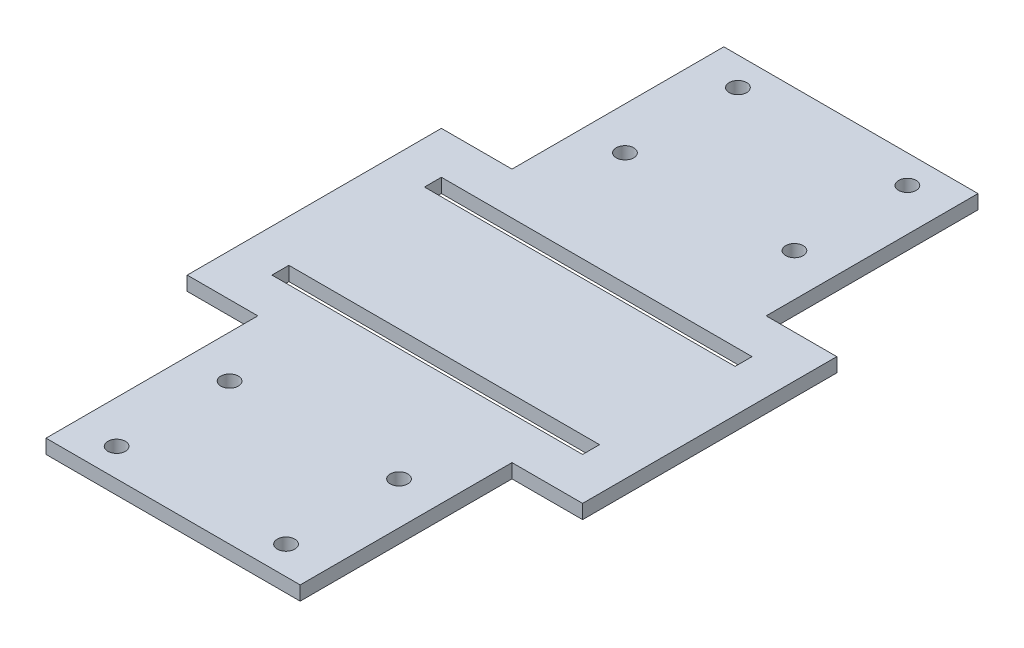
ISO-10303-21;
HEADER;
FILE_DESCRIPTION(('STEP AP214'),'2;1');
FILE_NAME('part.step','',(''),(''),'','','');
FILE_SCHEMA(('AUTOMOTIVE_DESIGN { 1 0 10303 214 1 1 1 1 }'));
ENDSEC;
DATA;
#1=APPLICATION_CONTEXT('core data for automotive mechanical design processes');
#2=APPLICATION_PROTOCOL_DEFINITION('international standard','automotive_design',2000,#1);
#3=PRODUCT_CONTEXT('',#1,'mechanical');
#4=PRODUCT('Part','Part','',(#3));
#5=PRODUCT_RELATED_PRODUCT_CATEGORY('part','',(#4));
#6=PRODUCT_DEFINITION_FORMATION('','',#4);
#7=PRODUCT_DEFINITION_CONTEXT('part definition',#1,'design');
#8=PRODUCT_DEFINITION('design','',#6,#7);
#9=PRODUCT_DEFINITION_SHAPE('','',#8);
#10=(LENGTH_UNIT() NAMED_UNIT(*) SI_UNIT(.MILLI.,.METRE.));
#11=(NAMED_UNIT(*) PLANE_ANGLE_UNIT() SI_UNIT($,.RADIAN.));
#12=(NAMED_UNIT(*) SI_UNIT($,.STERADIAN.) SOLID_ANGLE_UNIT());
#13=UNCERTAINTY_MEASURE_WITH_UNIT(LENGTH_MEASURE(1.E-05),#10,'distance_accuracy_value','');
#14=(GEOMETRIC_REPRESENTATION_CONTEXT(3) GLOBAL_UNCERTAINTY_ASSIGNED_CONTEXT((#13)) GLOBAL_UNIT_ASSIGNED_CONTEXT((#10,
#11,#12)) REPRESENTATION_CONTEXT('',''));
#15=CARTESIAN_POINT('',(0.,0.,0.));
#16=DIRECTION('',(0.,0.,1.));
#17=DIRECTION('',(1.,0.,0.));
#18=AXIS2_PLACEMENT_3D('',#15,#16,#17);
#19=CARTESIAN_POINT('',(45.,5.,45.));
#20=DIRECTION('',(-1.,0.,0.));
#21=DIRECTION('',(0.,0.,1.));
#22=AXIS2_PLACEMENT_3D('',#19,#20,#21);
#23=PLANE('',#22);
#24=DIRECTION('',(0.,0.,-1.));
#25=VECTOR('',#24,1.);
#26=CARTESIAN_POINT('',(45.,0.,45.));
#27=LINE('',#26,#25);
#28=CARTESIAN_POINT('',(45.,0.,120.));
#29=VERTEX_POINT('',#28);
#30=CARTESIAN_POINT('',(45.,0.,45.));
#31=VERTEX_POINT('',#30);
#32=EDGE_CURVE('E331',#29,#31,#27,.T.);
#33=ORIENTED_EDGE('',*,*,#32,.T.);
#34=DIRECTION('',(0.,-1.,0.));
#35=VECTOR('',#34,1.);
#36=CARTESIAN_POINT('',(45.,5.,45.));
#37=LINE('',#36,#35);
#38=CARTESIAN_POINT('',(45.,5.,45.));
#39=VERTEX_POINT('',#38);
#40=EDGE_CURVE('E11',#39,#31,#37,.T.);
#41=ORIENTED_EDGE('',*,*,#40,.F.);
#42=DIRECTION('',(0.,0.,-1.));
#43=VECTOR('',#42,1.);
#44=CARTESIAN_POINT('',(45.,5.,45.));
#45=LINE('',#44,#43);
#46=CARTESIAN_POINT('',(45.,5.,120.));
#47=VERTEX_POINT('',#46);
#48=EDGE_CURVE('E333',#47,#39,#45,.T.);
#49=ORIENTED_EDGE('',*,*,#48,.F.);
#50=DIRECTION('',(0.,1.,0.));
#51=VECTOR('',#50,1.);
#52=CARTESIAN_POINT('',(45.,0.,120.));
#53=LINE('',#52,#51);
#54=EDGE_CURVE('E301',#29,#47,#53,.T.);
#55=ORIENTED_EDGE('',*,*,#54,.F.);
#56=EDGE_LOOP('',(#33,#41,#49,#55));
#57=FACE_BOUND('',#56,.T.);
#58=ADVANCED_FACE('F35',(#57),#23,.F.);
#59=CARTESIAN_POINT('',(45.,5.,45.));
#60=DIRECTION('',(0.,0.,-1.));
#61=DIRECTION('',(-1.,0.,0.));
#62=AXIS2_PLACEMENT_3D('',#59,#60,#61);
#63=PLANE('',#62);
#64=DIRECTION('',(1.,0.,0.));
#65=VECTOR('',#64,1.);
#66=CARTESIAN_POINT('',(45.,0.,45.));
#67=LINE('',#66,#65);
#68=CARTESIAN_POINT('',(70.,0.,45.));
#69=VERTEX_POINT('',#68);
#70=EDGE_CURVE('E356',#31,#69,#67,.T.);
#71=ORIENTED_EDGE('',*,*,#70,.T.);
#72=DIRECTION('',(0.,1.,0.));
#73=VECTOR('',#72,1.);
#74=CARTESIAN_POINT('',(70.,0.,45.));
#75=LINE('',#74,#73);
#76=CARTESIAN_POINT('',(70.,5.,45.));
#77=VERTEX_POINT('',#76);
#78=EDGE_CURVE('E49',#69,#77,#75,.T.);
#79=ORIENTED_EDGE('',*,*,#78,.T.);
#80=DIRECTION('',(1.,0.,0.));
#81=VECTOR('',#80,1.);
#82=CARTESIAN_POINT('',(45.,5.,45.));
#83=LINE('',#82,#81);
#84=EDGE_CURVE('E336',#39,#77,#83,.T.);
#85=ORIENTED_EDGE('',*,*,#84,.F.);
#86=ORIENTED_EDGE('',*,*,#40,.T.);
#87=EDGE_LOOP('',(#71,#79,#85,#86));
#88=FACE_BOUND('',#87,.T.);
#89=ADVANCED_FACE('F400',(#88),#63,.F.);
#90=CARTESIAN_POINT('',(45.,5.,-45.));
#91=DIRECTION('',(0.,0.,1.));
#92=DIRECTION('',(1.,0.,0.));
#93=AXIS2_PLACEMENT_3D('',#90,#91,#92);
#94=PLANE('',#93);
#95=DIRECTION('',(-1.,0.,0.));
#96=VECTOR('',#95,1.);
#97=CARTESIAN_POINT('',(45.,5.,-45.));
#98=LINE('',#97,#96);
#99=CARTESIAN_POINT('',(70.,5.,-45.));
#100=VERTEX_POINT('',#99);
#101=CARTESIAN_POINT('',(45.,5.,-45.));
#102=VERTEX_POINT('',#101);
#103=EDGE_CURVE('E340',#100,#102,#98,.T.);
#104=ORIENTED_EDGE('',*,*,#103,.F.);
#105=DIRECTION('',(0.,1.,0.));
#106=VECTOR('',#105,1.);
#107=CARTESIAN_POINT('',(70.,0.,-45.));
#108=LINE('',#107,#106);
#109=CARTESIAN_POINT('',(70.,0.,-45.));
#110=VERTEX_POINT('',#109);
#111=EDGE_CURVE('E321',#110,#100,#108,.T.);
#112=ORIENTED_EDGE('',*,*,#111,.F.);
#113=DIRECTION('',(-1.,0.,0.));
#114=VECTOR('',#113,1.);
#115=CARTESIAN_POINT('',(45.,0.,-45.));
#116=LINE('',#115,#114);
#117=CARTESIAN_POINT('',(45.,0.,-45.));
#118=VERTEX_POINT('',#117);
#119=EDGE_CURVE('E359',#110,#118,#116,.T.);
#120=ORIENTED_EDGE('',*,*,#119,.T.);
#121=DIRECTION('',(0.,-1.,0.));
#122=VECTOR('',#121,1.);
#123=CARTESIAN_POINT('',(45.,5.,-45.));
#124=LINE('',#123,#122);
#125=EDGE_CURVE('E42',#102,#118,#124,.T.);
#126=ORIENTED_EDGE('',*,*,#125,.F.);
#127=EDGE_LOOP('',(#104,#112,#120,#126));
#128=FACE_BOUND('',#127,.T.);
#129=ADVANCED_FACE('F397',(#128),#94,.F.);
#130=CARTESIAN_POINT('',(45.,5.,-99.9999999999999));
#131=DIRECTION('',(-1.,0.,0.));
#132=DIRECTION('',(0.,0.,1.));
#133=AXIS2_PLACEMENT_3D('',#130,#131,#132);
#134=PLANE('',#133);
#135=DIRECTION('',(0.,0.,-1.));
#136=VECTOR('',#135,1.);
#137=CARTESIAN_POINT('',(45.,0.,-99.9999999999999));
#138=LINE('',#137,#136);
#139=CARTESIAN_POINT('',(45.,0.,-120.));
#140=VERTEX_POINT('',#139);
#141=EDGE_CURVE('E361',#118,#140,#138,.T.);
#142=ORIENTED_EDGE('',*,*,#141,.T.);
#143=DIRECTION('',(0.,1.,0.));
#144=VECTOR('',#143,1.);
#145=CARTESIAN_POINT('',(45.,0.,-120.));
#146=LINE('',#145,#144);
#147=CARTESIAN_POINT('',(45.,5.,-120.));
#148=VERTEX_POINT('',#147);
#149=EDGE_CURVE('E310',#140,#148,#146,.T.);
#150=ORIENTED_EDGE('',*,*,#149,.T.);
#151=DIRECTION('',(0.,0.,-1.));
#152=VECTOR('',#151,1.);
#153=CARTESIAN_POINT('',(45.,5.,-99.9999999999999));
#154=LINE('',#153,#152);
#155=EDGE_CURVE('E342',#102,#148,#154,.T.);
#156=ORIENTED_EDGE('',*,*,#155,.F.);
#157=ORIENTED_EDGE('',*,*,#125,.T.);
#158=EDGE_LOOP('',(#142,#150,#156,#157));
#159=FACE_BOUND('',#158,.T.);
#160=ADVANCED_FACE('F380',(#159),#134,.F.);
#161=CARTESIAN_POINT('',(-45.,5.,-99.9999999999999));
#162=DIRECTION('',(1.,0.,0.));
#163=DIRECTION('',(0.,0.,-1.));
#164=AXIS2_PLACEMENT_3D('',#161,#162,#163);
#165=PLANE('',#164);
#166=DIRECTION('',(0.,0.,1.));
#167=VECTOR('',#166,1.);
#168=CARTESIAN_POINT('',(-45.,0.,-99.9999999999999));
#169=LINE('',#168,#167);
#170=CARTESIAN_POINT('',(-45.,0.,-120.));
#171=VERTEX_POINT('',#170);
#172=CARTESIAN_POINT('',(-45.,0.,-45.));
#173=VERTEX_POINT('',#172);
#174=EDGE_CURVE('E363',#171,#173,#169,.T.);
#175=ORIENTED_EDGE('',*,*,#174,.T.);
#176=DIRECTION('',(0.,-1.,0.));
#177=VECTOR('',#176,1.);
#178=CARTESIAN_POINT('',(-45.,5.,-45.));
#179=LINE('',#178,#177);
#180=CARTESIAN_POINT('',(-45.,5.,-45.));
#181=VERTEX_POINT('',#180);
#182=EDGE_CURVE('E373',#181,#173,#179,.T.);
#183=ORIENTED_EDGE('',*,*,#182,.F.);
#184=DIRECTION('',(0.,0.,1.));
#185=VECTOR('',#184,1.);
#186=CARTESIAN_POINT('',(-45.,5.,-99.9999999999999));
#187=LINE('',#186,#185);
#188=CARTESIAN_POINT('',(-45.,5.,-120.));
#189=VERTEX_POINT('',#188);
#190=EDGE_CURVE('E344',#189,#181,#187,.T.);
#191=ORIENTED_EDGE('',*,*,#190,.F.);
#192=DIRECTION('',(0.,1.,0.));
#193=VECTOR('',#192,1.);
#194=CARTESIAN_POINT('',(-45.,0.,-120.));
#195=LINE('',#194,#193);
#196=EDGE_CURVE('E313',#171,#189,#195,.T.);
#197=ORIENTED_EDGE('',*,*,#196,.F.);
#198=EDGE_LOOP('',(#175,#183,#191,#197));
#199=FACE_BOUND('',#198,.T.);
#200=ADVANCED_FACE('F423',(#199),#165,.F.);
#201=CARTESIAN_POINT('',(-100.,5.,-45.));
#202=DIRECTION('',(0.,0.,1.));
#203=DIRECTION('',(1.,0.,0.));
#204=AXIS2_PLACEMENT_3D('',#201,#202,#203);
#205=PLANE('',#204);
#206=DIRECTION('',(-1.,0.,0.));
#207=VECTOR('',#206,1.);
#208=CARTESIAN_POINT('',(-100.,0.,-45.));
#209=LINE('',#208,#207);
#210=CARTESIAN_POINT('',(-70.,0.,-45.));
#211=VERTEX_POINT('',#210);
#212=EDGE_CURVE('E365',#173,#211,#209,.T.);
#213=ORIENTED_EDGE('',*,*,#212,.T.);
#214=DIRECTION('',(0.,1.,0.));
#215=VECTOR('',#214,1.);
#216=CARTESIAN_POINT('',(-70.,0.,-45.));
#217=LINE('',#216,#215);
#218=CARTESIAN_POINT('',(-70.,5.,-45.));
#219=VERTEX_POINT('',#218);
#220=EDGE_CURVE('E57',#211,#219,#217,.T.);
#221=ORIENTED_EDGE('',*,*,#220,.T.);
#222=DIRECTION('',(-1.,0.,0.));
#223=VECTOR('',#222,1.);
#224=CARTESIAN_POINT('',(-100.,5.,-45.));
#225=LINE('',#224,#223);
#226=EDGE_CURVE('E346',#181,#219,#225,.T.);
#227=ORIENTED_EDGE('',*,*,#226,.F.);
#228=ORIENTED_EDGE('',*,*,#182,.T.);
#229=EDGE_LOOP('',(#213,#221,#227,#228));
#230=FACE_BOUND('',#229,.T.);
#231=ADVANCED_FACE('F420',(#230),#205,.F.);
#232=CARTESIAN_POINT('',(-100.,5.,45.));
#233=DIRECTION('',(0.,0.,-1.));
#234=DIRECTION('',(-1.,0.,0.));
#235=AXIS2_PLACEMENT_3D('',#232,#233,#234);
#236=PLANE('',#235);
#237=DIRECTION('',(1.,0.,0.));
#238=VECTOR('',#237,1.);
#239=CARTESIAN_POINT('',(-100.,5.,45.));
#240=LINE('',#239,#238);
#241=CARTESIAN_POINT('',(-70.,5.,45.));
#242=VERTEX_POINT('',#241);
#243=CARTESIAN_POINT('',(-45.,5.,45.));
#244=VERTEX_POINT('',#243);
#245=EDGE_CURVE('E349',#242,#244,#240,.T.);
#246=ORIENTED_EDGE('',*,*,#245,.F.);
#247=DIRECTION('',(0.,1.,0.));
#248=VECTOR('',#247,1.);
#249=CARTESIAN_POINT('',(-70.,0.,45.));
#250=LINE('',#249,#248);
#251=CARTESIAN_POINT('',(-70.,0.,45.));
#252=VERTEX_POINT('',#251);
#253=EDGE_CURVE('E328',#252,#242,#250,.T.);
#254=ORIENTED_EDGE('',*,*,#253,.F.);
#255=DIRECTION('',(1.,0.,0.));
#256=VECTOR('',#255,1.);
#257=CARTESIAN_POINT('',(-100.,0.,45.));
#258=LINE('',#257,#256);
#259=CARTESIAN_POINT('',(-45.,0.,45.));
#260=VERTEX_POINT('',#259);
#261=EDGE_CURVE('E368',#252,#260,#258,.T.);
#262=ORIENTED_EDGE('',*,*,#261,.T.);
#263=DIRECTION('',(0.,-1.,0.));
#264=VECTOR('',#263,1.);
#265=CARTESIAN_POINT('',(-45.,5.,45.));
#266=LINE('',#265,#264);
#267=EDGE_CURVE('E353',#244,#260,#266,.T.);
#268=ORIENTED_EDGE('',*,*,#267,.F.);
#269=EDGE_LOOP('',(#246,#254,#262,#268));
#270=FACE_BOUND('',#269,.T.);
#271=ADVANCED_FACE('F417',(#270),#236,.F.);
#272=CARTESIAN_POINT('',(-45.,5.,45.));
#273=DIRECTION('',(1.,0.,0.));
#274=DIRECTION('',(0.,0.,-1.));
#275=AXIS2_PLACEMENT_3D('',#272,#273,#274);
#276=PLANE('',#275);
#277=DIRECTION('',(0.,0.,1.));
#278=VECTOR('',#277,1.);
#279=CARTESIAN_POINT('',(-45.,0.,45.));
#280=LINE('',#279,#278);
#281=CARTESIAN_POINT('',(-45.,0.,120.));
#282=VERTEX_POINT('',#281);
#283=EDGE_CURVE('E337',#260,#282,#280,.T.);
#284=ORIENTED_EDGE('',*,*,#283,.T.);
#285=DIRECTION('',(0.,1.,0.));
#286=VECTOR('',#285,1.);
#287=CARTESIAN_POINT('',(-45.,0.,120.));
#288=LINE('',#287,#286);
#289=CARTESIAN_POINT('',(-45.,5.,120.));
#290=VERTEX_POINT('',#289);
#291=EDGE_CURVE('E298',#282,#290,#288,.T.);
#292=ORIENTED_EDGE('',*,*,#291,.T.);
#293=DIRECTION('',(0.,0.,1.));
#294=VECTOR('',#293,1.);
#295=CARTESIAN_POINT('',(-45.,5.,45.));
#296=LINE('',#295,#294);
#297=EDGE_CURVE('E351',#244,#290,#296,.T.);
#298=ORIENTED_EDGE('',*,*,#297,.F.);
#299=ORIENTED_EDGE('',*,*,#267,.T.);
#300=EDGE_LOOP('',(#284,#292,#298,#299));
#301=FACE_BOUND('',#300,.T.);
#302=ADVANCED_FACE('F413',(#301),#276,.F.);
#303=CARTESIAN_POINT('',(0.,5.,0.));
#304=DIRECTION('',(0.,1.,0.));
#305=DIRECTION('',(0.,0.,1.));
#306=AXIS2_PLACEMENT_3D('',#303,#304,#305);
#307=PLANE('',#306);
#308=DIRECTION('',(1.,0.,0.));
#309=VECTOR('',#308,1.);
#310=CARTESIAN_POINT('',(-50.,5.,30.));
#311=LINE('',#310,#309);
#312=CARTESIAN_POINT('',(-55.,5.,30.));
#313=VERTEX_POINT('',#312);
#314=CARTESIAN_POINT('',(55.,5.,30.));
#315=VERTEX_POINT('',#314);
#316=EDGE_CURVE('E233',#313,#315,#311,.T.);
#317=ORIENTED_EDGE('',*,*,#316,.F.);
#318=DIRECTION('',(0.,0.,1.));
#319=VECTOR('',#318,1.);
#320=CARTESIAN_POINT('',(-55.,5.,30.));
#321=LINE('',#320,#319);
#322=CARTESIAN_POINT('',(-55.,5.,24.));
#323=VERTEX_POINT('',#322);
#324=EDGE_CURVE('E197',#323,#313,#321,.T.);
#325=ORIENTED_EDGE('',*,*,#324,.F.);
#326=DIRECTION('',(-1.,0.,0.));
#327=VECTOR('',#326,1.);
#328=CARTESIAN_POINT('',(-50.,5.,24.));
#329=LINE('',#328,#327);
#330=CARTESIAN_POINT('',(55.,5.,24.));
#331=VERTEX_POINT('',#330);
#332=EDGE_CURVE('E188',#331,#323,#329,.T.);
#333=ORIENTED_EDGE('',*,*,#332,.F.);
#334=DIRECTION('',(0.,0.,-1.));
#335=VECTOR('',#334,1.);
#336=CARTESIAN_POINT('',(55.,5.,30.));
#337=LINE('',#336,#335);
#338=EDGE_CURVE('E212',#315,#331,#337,.T.);
#339=ORIENTED_EDGE('',*,*,#338,.F.);
#340=EDGE_LOOP('',(#317,#325,#333,#339));
#341=FACE_BOUND('',#340,.T.);
#342=DIRECTION('',(1.,0.,0.));
#343=VECTOR('',#342,1.);
#344=CARTESIAN_POINT('',(-50.,5.,-24.));
#345=LINE('',#344,#343);
#346=CARTESIAN_POINT('',(-55.,5.,-24.));
#347=VERTEX_POINT('',#346);
#348=CARTESIAN_POINT('',(55.,5.,-24.));
#349=VERTEX_POINT('',#348);
#350=EDGE_CURVE('E182',#347,#349,#345,.T.);
#351=ORIENTED_EDGE('',*,*,#350,.F.);
#352=DIRECTION('',(0.,0.,1.));
#353=VECTOR('',#352,1.);
#354=CARTESIAN_POINT('',(-55.,5.,-30.));
#355=LINE('',#354,#353);
#356=CARTESIAN_POINT('',(-55.,5.,-30.));
#357=VERTEX_POINT('',#356);
#358=EDGE_CURVE('E201',#357,#347,#355,.T.);
#359=ORIENTED_EDGE('',*,*,#358,.F.);
#360=DIRECTION('',(-1.,0.,0.));
#361=VECTOR('',#360,1.);
#362=CARTESIAN_POINT('',(-50.,5.,-30.));
#363=LINE('',#362,#361);
#364=CARTESIAN_POINT('',(55.,5.,-30.));
#365=VERTEX_POINT('',#364);
#366=EDGE_CURVE('E242',#365,#357,#363,.T.);
#367=ORIENTED_EDGE('',*,*,#366,.F.);
#368=DIRECTION('',(0.,0.,-1.));
#369=VECTOR('',#368,1.);
#370=CARTESIAN_POINT('',(55.,5.,-24.));
#371=LINE('',#370,#369);
#372=EDGE_CURVE('E221',#349,#365,#371,.T.);
#373=ORIENTED_EDGE('',*,*,#372,.F.);
#374=EDGE_LOOP('',(#351,#359,#367,#373));
#375=FACE_BOUND('',#374,.T.);
#376=CARTESIAN_POINT('',(29.9999999999999,5.,70.0000000000001));
#377=DIRECTION('',(0.,1.,0.));
#378=DIRECTION('',(0.,0.,1.));
#379=AXIS2_PLACEMENT_3D('',#376,#377,#378);
#380=CIRCLE('',#379,3.1);
#381=CARTESIAN_POINT('',(29.9999999999999,5.,73.1000000000001));
#382=VERTEX_POINT('',#381);
#383=EDGE_CURVE('E244',#382,#382,#380,.T.);
#384=ORIENTED_EDGE('',*,*,#383,.F.);
#385=EDGE_LOOP('',(#384));
#386=FACE_BOUND('',#385,.T.);
#387=CARTESIAN_POINT('',(30.,5.,110.));
#388=DIRECTION('',(0.,1.,0.));
#389=DIRECTION('',(0.,0.,1.));
#390=AXIS2_PLACEMENT_3D('',#387,#388,#389);
#391=CIRCLE('',#390,3.1);
#392=CARTESIAN_POINT('',(30.,5.,113.1));
#393=VERTEX_POINT('',#392);
#394=EDGE_CURVE('E250',#393,#393,#391,.T.);
#395=ORIENTED_EDGE('',*,*,#394,.F.);
#396=EDGE_LOOP('',(#395));
#397=FACE_BOUND('',#396,.T.);
#398=CARTESIAN_POINT('',(-30.0000000000001,5.,70.0000000000001));
#399=DIRECTION('',(0.,1.,0.));
#400=DIRECTION('',(0.,0.,1.));
#401=AXIS2_PLACEMENT_3D('',#398,#399,#400);
#402=CIRCLE('',#401,3.1);
#403=CARTESIAN_POINT('',(-30.0000000000001,5.,73.1000000000001));
#404=VERTEX_POINT('',#403);
#405=EDGE_CURVE('E256',#404,#404,#402,.T.);
#406=ORIENTED_EDGE('',*,*,#405,.F.);
#407=EDGE_LOOP('',(#406));
#408=FACE_BOUND('',#407,.T.);
#409=CARTESIAN_POINT('',(-30.,5.,110.));
#410=DIRECTION('',(0.,1.,0.));
#411=DIRECTION('',(0.,0.,1.));
#412=AXIS2_PLACEMENT_3D('',#409,#410,#411);
#413=CIRCLE('',#412,3.10000000000001);
#414=CARTESIAN_POINT('',(-30.,5.,113.1));
#415=VERTEX_POINT('',#414);
#416=EDGE_CURVE('E262',#415,#415,#413,.T.);
#417=ORIENTED_EDGE('',*,*,#416,.F.);
#418=EDGE_LOOP('',(#417));
#419=FACE_BOUND('',#418,.T.);
#420=CARTESIAN_POINT('',(30.0000000000004,5.,-70.));
#421=DIRECTION('',(0.,1.,0.));
#422=DIRECTION('',(0.,0.,1.));
#423=AXIS2_PLACEMENT_3D('',#420,#421,#422);
#424=CIRCLE('',#423,3.1);
#425=CARTESIAN_POINT('',(30.0000000000004,5.,-66.8999999999999));
#426=VERTEX_POINT('',#425);
#427=EDGE_CURVE('E268',#426,#426,#424,.T.);
#428=ORIENTED_EDGE('',*,*,#427,.F.);
#429=EDGE_LOOP('',(#428));
#430=FACE_BOUND('',#429,.T.);
#431=CARTESIAN_POINT('',(30.,5.,-110.));
#432=DIRECTION('',(0.,1.,0.));
#433=DIRECTION('',(0.,0.,1.));
#434=AXIS2_PLACEMENT_3D('',#431,#432,#433);
#435=CIRCLE('',#434,3.1);
#436=CARTESIAN_POINT('',(30.,5.,-106.9));
#437=VERTEX_POINT('',#436);
#438=EDGE_CURVE('E274',#437,#437,#435,.T.);
#439=ORIENTED_EDGE('',*,*,#438,.F.);
#440=EDGE_LOOP('',(#439));
#441=FACE_BOUND('',#440,.T.);
#442=CARTESIAN_POINT('',(-29.9999999999996,5.,-70.));
#443=DIRECTION('',(0.,1.,0.));
#444=DIRECTION('',(0.,0.,1.));
#445=AXIS2_PLACEMENT_3D('',#442,#443,#444);
#446=CIRCLE('',#445,3.10000000000001);
#447=CARTESIAN_POINT('',(-29.9999999999996,5.,-66.8999999999999));
#448=VERTEX_POINT('',#447);
#449=EDGE_CURVE('E280',#448,#448,#446,.T.);
#450=ORIENTED_EDGE('',*,*,#449,.F.);
#451=EDGE_LOOP('',(#450));
#452=FACE_BOUND('',#451,.T.);
#453=CARTESIAN_POINT('',(-30.,5.,-110.));
#454=DIRECTION('',(0.,1.,0.));
#455=DIRECTION('',(0.,0.,1.));
#456=AXIS2_PLACEMENT_3D('',#453,#454,#455);
#457=CIRCLE('',#456,3.10000000000001);
#458=CARTESIAN_POINT('',(-30.,5.,-106.9));
#459=VERTEX_POINT('',#458);
#460=EDGE_CURVE('E286',#459,#459,#457,.T.);
#461=ORIENTED_EDGE('',*,*,#460,.F.);
#462=EDGE_LOOP('',(#461));
#463=FACE_BOUND('',#462,.T.);
#464=DIRECTION('',(0.,0.,1.));
#465=VECTOR('',#464,1.);
#466=CARTESIAN_POINT('',(70.,5.,-45.));
#467=LINE('',#466,#465);
#468=EDGE_CURVE('E316',#100,#77,#467,.T.);
#469=ORIENTED_EDGE('',*,*,#468,.F.);
#470=ORIENTED_EDGE('',*,*,#103,.T.);
#471=ORIENTED_EDGE('',*,*,#155,.T.);
#472=DIRECTION('',(-1.,0.,0.));
#473=VECTOR('',#472,1.);
#474=CARTESIAN_POINT('',(-45.,5.,-120.));
#475=LINE('',#474,#473);
#476=EDGE_CURVE('E304',#148,#189,#475,.T.);
#477=ORIENTED_EDGE('',*,*,#476,.T.);
#478=ORIENTED_EDGE('',*,*,#190,.T.);
#479=ORIENTED_EDGE('',*,*,#226,.T.);
#480=DIRECTION('',(0.,0.,-1.));
#481=VECTOR('',#480,1.);
#482=CARTESIAN_POINT('',(-70.,5.,-45.));
#483=LINE('',#482,#481);
#484=EDGE_CURVE('E324',#242,#219,#483,.T.);
#485=ORIENTED_EDGE('',*,*,#484,.F.);
#486=ORIENTED_EDGE('',*,*,#245,.T.);
#487=ORIENTED_EDGE('',*,*,#297,.T.);
#488=DIRECTION('',(1.,0.,0.));
#489=VECTOR('',#488,1.);
#490=CARTESIAN_POINT('',(45.,5.,120.));
#491=LINE('',#490,#489);
#492=EDGE_CURVE('E292',#290,#47,#491,.T.);
#493=ORIENTED_EDGE('',*,*,#492,.T.);
#494=ORIENTED_EDGE('',*,*,#48,.T.);
#495=ORIENTED_EDGE('',*,*,#84,.T.);
#496=EDGE_LOOP('',(#469,#470,#471,#477,#478,#479,#485,#486,#487,#493,#494,#495));
#497=FACE_BOUND('',#496,.T.);
#498=ADVANCED_FACE('F394',(#341,#375,#386,#397,#408,#419,#430,#441,#452,#463,#497),#307,.T.);
#499=CARTESIAN_POINT('',(0.,0.,0.));
#500=DIRECTION('',(0.,1.,0.));
#501=DIRECTION('',(0.,0.,1.));
#502=AXIS2_PLACEMENT_3D('',#499,#500,#501);
#503=PLANE('',#502);
#504=DIRECTION('',(0.,0.,1.));
#505=VECTOR('',#504,1.);
#506=CARTESIAN_POINT('',(-55.,0.,30.));
#507=LINE('',#506,#505);
#508=CARTESIAN_POINT('',(-55.,0.,24.));
#509=VERTEX_POINT('',#508);
#510=CARTESIAN_POINT('',(-55.,0.,30.));
#511=VERTEX_POINT('',#510);
#512=EDGE_CURVE('E176',#509,#511,#507,.T.);
#513=ORIENTED_EDGE('',*,*,#512,.T.);
#514=DIRECTION('',(1.,0.,0.));
#515=VECTOR('',#514,1.);
#516=CARTESIAN_POINT('',(-50.,0.,30.));
#517=LINE('',#516,#515);
#518=CARTESIAN_POINT('',(55.,0.,30.));
#519=VERTEX_POINT('',#518);
#520=EDGE_CURVE('E183',#511,#519,#517,.T.);
#521=ORIENTED_EDGE('',*,*,#520,.T.);
#522=DIRECTION('',(0.,0.,-1.));
#523=VECTOR('',#522,1.);
#524=CARTESIAN_POINT('',(55.,0.,30.));
#525=LINE('',#524,#523);
#526=CARTESIAN_POINT('',(55.,0.,24.));
#527=VERTEX_POINT('',#526);
#528=EDGE_CURVE('E178',#519,#527,#525,.T.);
#529=ORIENTED_EDGE('',*,*,#528,.T.);
#530=DIRECTION('',(-1.,0.,0.));
#531=VECTOR('',#530,1.);
#532=CARTESIAN_POINT('',(-50.,0.,24.));
#533=LINE('',#532,#531);
#534=EDGE_CURVE('E171',#527,#509,#533,.T.);
#535=ORIENTED_EDGE('',*,*,#534,.T.);
#536=EDGE_LOOP('',(#513,#521,#529,#535));
#537=FACE_BOUND('',#536,.T.);
#538=DIRECTION('',(0.,0.,1.));
#539=VECTOR('',#538,1.);
#540=CARTESIAN_POINT('',(-55.,0.,-30.));
#541=LINE('',#540,#539);
#542=CARTESIAN_POINT('',(-55.,0.,-30.));
#543=VERTEX_POINT('',#542);
#544=CARTESIAN_POINT('',(-55.,0.,-24.));
#545=VERTEX_POINT('',#544);
#546=EDGE_CURVE('E203',#543,#545,#541,.T.);
#547=ORIENTED_EDGE('',*,*,#546,.T.);
#548=DIRECTION('',(1.,0.,0.));
#549=VECTOR('',#548,1.);
#550=CARTESIAN_POINT('',(-50.,0.,-24.));
#551=LINE('',#550,#549);
#552=CARTESIAN_POINT('',(55.,0.,-24.));
#553=VERTEX_POINT('',#552);
#554=EDGE_CURVE('E239',#545,#553,#551,.T.);
#555=ORIENTED_EDGE('',*,*,#554,.T.);
#556=DIRECTION('',(0.,0.,-1.));
#557=VECTOR('',#556,1.);
#558=CARTESIAN_POINT('',(55.,0.,-24.));
#559=LINE('',#558,#557);
#560=CARTESIAN_POINT('',(55.,0.,-30.));
#561=VERTEX_POINT('',#560);
#562=EDGE_CURVE('E224',#553,#561,#559,.T.);
#563=ORIENTED_EDGE('',*,*,#562,.T.);
#564=DIRECTION('',(-1.,0.,0.));
#565=VECTOR('',#564,1.);
#566=CARTESIAN_POINT('',(-50.,0.,-30.));
#567=LINE('',#566,#565);
#568=EDGE_CURVE('E241',#561,#543,#567,.T.);
#569=ORIENTED_EDGE('',*,*,#568,.T.);
#570=EDGE_LOOP('',(#547,#555,#563,#569));
#571=FACE_BOUND('',#570,.T.);
#572=CARTESIAN_POINT('',(29.9999999999999,0.,70.0000000000001));
#573=DIRECTION('',(0.,1.,0.));
#574=DIRECTION('',(0.,0.,1.));
#575=AXIS2_PLACEMENT_3D('',#572,#573,#574);
#576=CIRCLE('',#575,3.1);
#577=CARTESIAN_POINT('',(29.9999999999999,0.,73.1000000000001));
#578=VERTEX_POINT('',#577);
#579=EDGE_CURVE('E247',#578,#578,#576,.T.);
#580=ORIENTED_EDGE('',*,*,#579,.T.);
#581=EDGE_LOOP('',(#580));
#582=FACE_BOUND('',#581,.T.);
#583=CARTESIAN_POINT('',(30.,0.,110.));
#584=DIRECTION('',(0.,1.,0.));
#585=DIRECTION('',(0.,0.,1.));
#586=AXIS2_PLACEMENT_3D('',#583,#584,#585);
#587=CIRCLE('',#586,3.1);
#588=CARTESIAN_POINT('',(30.,0.,113.1));
#589=VERTEX_POINT('',#588);
#590=EDGE_CURVE('E253',#589,#589,#587,.T.);
#591=ORIENTED_EDGE('',*,*,#590,.T.);
#592=EDGE_LOOP('',(#591));
#593=FACE_BOUND('',#592,.T.);
#594=CARTESIAN_POINT('',(-30.0000000000001,0.,70.0000000000001));
#595=DIRECTION('',(0.,1.,0.));
#596=DIRECTION('',(0.,0.,1.));
#597=AXIS2_PLACEMENT_3D('',#594,#595,#596);
#598=CIRCLE('',#597,3.1);
#599=CARTESIAN_POINT('',(-30.0000000000001,0.,73.1000000000001));
#600=VERTEX_POINT('',#599);
#601=EDGE_CURVE('E259',#600,#600,#598,.T.);
#602=ORIENTED_EDGE('',*,*,#601,.T.);
#603=EDGE_LOOP('',(#602));
#604=FACE_BOUND('',#603,.T.);
#605=CARTESIAN_POINT('',(-30.,0.,110.));
#606=DIRECTION('',(0.,1.,0.));
#607=DIRECTION('',(0.,0.,1.));
#608=AXIS2_PLACEMENT_3D('',#605,#606,#607);
#609=CIRCLE('',#608,3.10000000000001);
#610=CARTESIAN_POINT('',(-30.,0.,113.1));
#611=VERTEX_POINT('',#610);
#612=EDGE_CURVE('E265',#611,#611,#609,.T.);
#613=ORIENTED_EDGE('',*,*,#612,.T.);
#614=EDGE_LOOP('',(#613));
#615=FACE_BOUND('',#614,.T.);
#616=CARTESIAN_POINT('',(30.0000000000004,0.,-70.));
#617=DIRECTION('',(0.,1.,0.));
#618=DIRECTION('',(0.,0.,1.));
#619=AXIS2_PLACEMENT_3D('',#616,#617,#618);
#620=CIRCLE('',#619,3.1);
#621=CARTESIAN_POINT('',(30.0000000000004,0.,-66.8999999999999));
#622=VERTEX_POINT('',#621);
#623=EDGE_CURVE('E271',#622,#622,#620,.T.);
#624=ORIENTED_EDGE('',*,*,#623,.T.);
#625=EDGE_LOOP('',(#624));
#626=FACE_BOUND('',#625,.T.);
#627=CARTESIAN_POINT('',(30.,0.,-110.));
#628=DIRECTION('',(0.,1.,0.));
#629=DIRECTION('',(0.,0.,1.));
#630=AXIS2_PLACEMENT_3D('',#627,#628,#629);
#631=CIRCLE('',#630,3.1);
#632=CARTESIAN_POINT('',(30.,0.,-106.9));
#633=VERTEX_POINT('',#632);
#634=EDGE_CURVE('E277',#633,#633,#631,.T.);
#635=ORIENTED_EDGE('',*,*,#634,.T.);
#636=EDGE_LOOP('',(#635));
#637=FACE_BOUND('',#636,.T.);
#638=CARTESIAN_POINT('',(-29.9999999999996,0.,-70.));
#639=DIRECTION('',(0.,1.,0.));
#640=DIRECTION('',(0.,0.,1.));
#641=AXIS2_PLACEMENT_3D('',#638,#639,#640);
#642=CIRCLE('',#641,3.10000000000001);
#643=CARTESIAN_POINT('',(-29.9999999999996,0.,-66.8999999999999));
#644=VERTEX_POINT('',#643);
#645=EDGE_CURVE('E283',#644,#644,#642,.T.);
#646=ORIENTED_EDGE('',*,*,#645,.T.);
#647=EDGE_LOOP('',(#646));
#648=FACE_BOUND('',#647,.T.);
#649=CARTESIAN_POINT('',(-30.,0.,-110.));
#650=DIRECTION('',(0.,1.,0.));
#651=DIRECTION('',(0.,0.,1.));
#652=AXIS2_PLACEMENT_3D('',#649,#650,#651);
#653=CIRCLE('',#652,3.10000000000001);
#654=CARTESIAN_POINT('',(-30.,0.,-106.9));
#655=VERTEX_POINT('',#654);
#656=EDGE_CURVE('E289',#655,#655,#653,.T.);
#657=ORIENTED_EDGE('',*,*,#656,.T.);
#658=EDGE_LOOP('',(#657));
#659=FACE_BOUND('',#658,.T.);
#660=ORIENTED_EDGE('',*,*,#119,.F.);
#661=DIRECTION('',(0.,0.,1.));
#662=VECTOR('',#661,1.);
#663=CARTESIAN_POINT('',(70.,0.,-45.));
#664=LINE('',#663,#662);
#665=EDGE_CURVE('E319',#110,#69,#664,.T.);
#666=ORIENTED_EDGE('',*,*,#665,.T.);
#667=ORIENTED_EDGE('',*,*,#70,.F.);
#668=ORIENTED_EDGE('',*,*,#32,.F.);
#669=DIRECTION('',(1.,0.,0.));
#670=VECTOR('',#669,1.);
#671=CARTESIAN_POINT('',(45.,0.,120.));
#672=LINE('',#671,#670);
#673=EDGE_CURVE('E295',#282,#29,#672,.T.);
#674=ORIENTED_EDGE('',*,*,#673,.F.);
#675=ORIENTED_EDGE('',*,*,#283,.F.);
#676=ORIENTED_EDGE('',*,*,#261,.F.);
#677=DIRECTION('',(0.,0.,-1.));
#678=VECTOR('',#677,1.);
#679=CARTESIAN_POINT('',(-70.,0.,-45.));
#680=LINE('',#679,#678);
#681=EDGE_CURVE('E326',#252,#211,#680,.T.);
#682=ORIENTED_EDGE('',*,*,#681,.T.);
#683=ORIENTED_EDGE('',*,*,#212,.F.);
#684=ORIENTED_EDGE('',*,*,#174,.F.);
#685=DIRECTION('',(-1.,0.,0.));
#686=VECTOR('',#685,1.);
#687=CARTESIAN_POINT('',(-45.,0.,-120.));
#688=LINE('',#687,#686);
#689=EDGE_CURVE('E307',#140,#171,#688,.T.);
#690=ORIENTED_EDGE('',*,*,#689,.F.);
#691=ORIENTED_EDGE('',*,*,#141,.F.);
#692=EDGE_LOOP('',(#660,#666,#667,#668,#674,#675,#676,#682,#683,#684,#690,#691));
#693=FACE_BOUND('',#692,.T.);
#694=ADVANCED_FACE('F173',(#537,#571,#582,#593,#604,#615,#626,#637,#648,#659,#693),#503,.F.);
#695=CARTESIAN_POINT('',(-70.,0.,-45.));
#696=DIRECTION('',(1.,0.,0.));
#697=DIRECTION('',(0.,0.,-1.));
#698=AXIS2_PLACEMENT_3D('',#695,#696,#697);
#699=PLANE('',#698);
#700=ORIENTED_EDGE('',*,*,#484,.T.);
#701=ORIENTED_EDGE('',*,*,#220,.F.);
#702=ORIENTED_EDGE('',*,*,#681,.F.);
#703=ORIENTED_EDGE('',*,*,#253,.T.);
#704=EDGE_LOOP('',(#700,#701,#702,#703));
#705=FACE_BOUND('',#704,.T.);
#706=ADVANCED_FACE('F647',(#705),#699,.F.);
#707=CARTESIAN_POINT('',(70.,0.,-45.));
#708=DIRECTION('',(-1.,0.,0.));
#709=DIRECTION('',(0.,0.,1.));
#710=AXIS2_PLACEMENT_3D('',#707,#708,#709);
#711=PLANE('',#710);
#712=ORIENTED_EDGE('',*,*,#468,.T.);
#713=ORIENTED_EDGE('',*,*,#78,.F.);
#714=ORIENTED_EDGE('',*,*,#665,.F.);
#715=ORIENTED_EDGE('',*,*,#111,.T.);
#716=EDGE_LOOP('',(#712,#713,#714,#715));
#717=FACE_BOUND('',#716,.T.);
#718=ADVANCED_FACE('F398',(#717),#711,.F.);
#719=CARTESIAN_POINT('',(-45.,0.,-120.));
#720=DIRECTION('',(0.,0.,-1.));
#721=DIRECTION('',(-1.,0.,0.));
#722=AXIS2_PLACEMENT_3D('',#719,#720,#721);
#723=PLANE('',#722);
#724=ORIENTED_EDGE('',*,*,#476,.F.);
#725=ORIENTED_EDGE('',*,*,#149,.F.);
#726=ORIENTED_EDGE('',*,*,#689,.T.);
#727=ORIENTED_EDGE('',*,*,#196,.T.);
#728=EDGE_LOOP('',(#724,#725,#726,#727));
#729=FACE_BOUND('',#728,.T.);
#730=ADVANCED_FACE('F391',(#729),#723,.T.);
#731=CARTESIAN_POINT('',(45.,0.,120.));
#732=DIRECTION('',(0.,0.,1.));
#733=DIRECTION('',(1.,0.,0.));
#734=AXIS2_PLACEMENT_3D('',#731,#732,#733);
#735=PLANE('',#734);
#736=ORIENTED_EDGE('',*,*,#492,.F.);
#737=ORIENTED_EDGE('',*,*,#291,.F.);
#738=ORIENTED_EDGE('',*,*,#673,.T.);
#739=ORIENTED_EDGE('',*,*,#54,.T.);
#740=EDGE_LOOP('',(#736,#737,#738,#739));
#741=FACE_BOUND('',#740,.T.);
#742=ADVANCED_FACE('F410',(#741),#735,.T.);
#743=CARTESIAN_POINT('',(-30.,0.,-110.));
#744=DIRECTION('',(0.,1.,0.));
#745=DIRECTION('',(0.,0.,1.));
#746=AXIS2_PLACEMENT_3D('',#743,#744,#745);
#747=CYLINDRICAL_SURFACE('',#746,3.10000000000001);
#748=ORIENTED_EDGE('',*,*,#656,.F.);
#749=EDGE_LOOP('',(#748));
#750=FACE_BOUND('',#749,.T.);
#751=ORIENTED_EDGE('',*,*,#460,.T.);
#752=EDGE_LOOP('',(#751));
#753=FACE_BOUND('',#752,.T.);
#754=ADVANCED_FACE('F492',(#750,#753),#747,.F.);
#755=CARTESIAN_POINT('',(-29.9999999999996,0.,-70.));
#756=DIRECTION('',(0.,1.,0.));
#757=DIRECTION('',(0.,0.,1.));
#758=AXIS2_PLACEMENT_3D('',#755,#756,#757);
#759=CYLINDRICAL_SURFACE('',#758,3.10000000000001);
#760=ORIENTED_EDGE('',*,*,#645,.F.);
#761=EDGE_LOOP('',(#760));
#762=FACE_BOUND('',#761,.T.);
#763=ORIENTED_EDGE('',*,*,#449,.T.);
#764=EDGE_LOOP('',(#763));
#765=FACE_BOUND('',#764,.T.);
#766=ADVANCED_FACE('F502',(#762,#765),#759,.F.);
#767=CARTESIAN_POINT('',(30.,0.,-110.));
#768=DIRECTION('',(0.,1.,0.));
#769=DIRECTION('',(0.,0.,1.));
#770=AXIS2_PLACEMENT_3D('',#767,#768,#769);
#771=CYLINDRICAL_SURFACE('',#770,3.1);
#772=ORIENTED_EDGE('',*,*,#634,.F.);
#773=EDGE_LOOP('',(#772));
#774=FACE_BOUND('',#773,.T.);
#775=ORIENTED_EDGE('',*,*,#438,.T.);
#776=EDGE_LOOP('',(#775));
#777=FACE_BOUND('',#776,.T.);
#778=ADVANCED_FACE('F512',(#774,#777),#771,.F.);
#779=CARTESIAN_POINT('',(30.0000000000004,0.,-70.));
#780=DIRECTION('',(0.,1.,0.));
#781=DIRECTION('',(0.,0.,1.));
#782=AXIS2_PLACEMENT_3D('',#779,#780,#781);
#783=CYLINDRICAL_SURFACE('',#782,3.1);
#784=ORIENTED_EDGE('',*,*,#623,.F.);
#785=EDGE_LOOP('',(#784));
#786=FACE_BOUND('',#785,.T.);
#787=ORIENTED_EDGE('',*,*,#427,.T.);
#788=EDGE_LOOP('',(#787));
#789=FACE_BOUND('',#788,.T.);
#790=ADVANCED_FACE('F522',(#786,#789),#783,.F.);
#791=CARTESIAN_POINT('',(-30.,0.,110.));
#792=DIRECTION('',(0.,1.,0.));
#793=DIRECTION('',(0.,0.,1.));
#794=AXIS2_PLACEMENT_3D('',#791,#792,#793);
#795=CYLINDRICAL_SURFACE('',#794,3.10000000000001);
#796=ORIENTED_EDGE('',*,*,#612,.F.);
#797=EDGE_LOOP('',(#796));
#798=FACE_BOUND('',#797,.T.);
#799=ORIENTED_EDGE('',*,*,#416,.T.);
#800=EDGE_LOOP('',(#799));
#801=FACE_BOUND('',#800,.T.);
#802=ADVANCED_FACE('F532',(#798,#801),#795,.F.);
#803=CARTESIAN_POINT('',(-30.0000000000001,0.,70.0000000000001));
#804=DIRECTION('',(0.,1.,0.));
#805=DIRECTION('',(0.,0.,1.));
#806=AXIS2_PLACEMENT_3D('',#803,#804,#805);
#807=CYLINDRICAL_SURFACE('',#806,3.1);
#808=ORIENTED_EDGE('',*,*,#601,.F.);
#809=EDGE_LOOP('',(#808));
#810=FACE_BOUND('',#809,.T.);
#811=ORIENTED_EDGE('',*,*,#405,.T.);
#812=EDGE_LOOP('',(#811));
#813=FACE_BOUND('',#812,.T.);
#814=ADVANCED_FACE('F542',(#810,#813),#807,.F.);
#815=CARTESIAN_POINT('',(30.,0.,110.));
#816=DIRECTION('',(0.,1.,0.));
#817=DIRECTION('',(0.,0.,1.));
#818=AXIS2_PLACEMENT_3D('',#815,#816,#817);
#819=CYLINDRICAL_SURFACE('',#818,3.1);
#820=ORIENTED_EDGE('',*,*,#590,.F.);
#821=EDGE_LOOP('',(#820));
#822=FACE_BOUND('',#821,.T.);
#823=ORIENTED_EDGE('',*,*,#394,.T.);
#824=EDGE_LOOP('',(#823));
#825=FACE_BOUND('',#824,.T.);
#826=ADVANCED_FACE('F552',(#822,#825),#819,.F.);
#827=CARTESIAN_POINT('',(29.9999999999999,0.,70.0000000000001));
#828=DIRECTION('',(0.,1.,0.));
#829=DIRECTION('',(0.,0.,1.));
#830=AXIS2_PLACEMENT_3D('',#827,#828,#829);
#831=CYLINDRICAL_SURFACE('',#830,3.1);
#832=ORIENTED_EDGE('',*,*,#579,.F.);
#833=EDGE_LOOP('',(#832));
#834=FACE_BOUND('',#833,.T.);
#835=ORIENTED_EDGE('',*,*,#383,.T.);
#836=EDGE_LOOP('',(#835));
#837=FACE_BOUND('',#836,.T.);
#838=ADVANCED_FACE('F562',(#834,#837),#831,.F.);
#839=CARTESIAN_POINT('',(-50.,0.,-30.));
#840=DIRECTION('',(0.,0.,-1.));
#841=DIRECTION('',(-1.,0.,0.));
#842=AXIS2_PLACEMENT_3D('',#839,#840,#841);
#843=PLANE('',#842);
#844=ORIENTED_EDGE('',*,*,#366,.T.);
#845=DIRECTION('',(0.,1.,0.));
#846=VECTOR('',#845,1.);
#847=CARTESIAN_POINT('',(-55.,0.,-30.));
#848=LINE('',#847,#846);
#849=EDGE_CURVE('E206',#543,#357,#848,.T.);
#850=ORIENTED_EDGE('',*,*,#849,.F.);
#851=ORIENTED_EDGE('',*,*,#568,.F.);
#852=DIRECTION('',(0.,1.,0.));
#853=VECTOR('',#852,1.);
#854=CARTESIAN_POINT('',(55.,0.,-30.));
#855=LINE('',#854,#853);
#856=EDGE_CURVE('E230',#561,#365,#855,.T.);
#857=ORIENTED_EDGE('',*,*,#856,.T.);
#858=EDGE_LOOP('',(#844,#850,#851,#857));
#859=FACE_BOUND('',#858,.T.);
#860=ADVANCED_FACE('F572',(#859),#843,.F.);
#861=CARTESIAN_POINT('',(-50.,0.,-24.));
#862=DIRECTION('',(0.,0.,1.));
#863=DIRECTION('',(1.,0.,0.));
#864=AXIS2_PLACEMENT_3D('',#861,#862,#863);
#865=PLANE('',#864);
#866=ORIENTED_EDGE('',*,*,#350,.T.);
#867=DIRECTION('',(0.,1.,0.));
#868=VECTOR('',#867,1.);
#869=CARTESIAN_POINT('',(55.,0.,-24.));
#870=LINE('',#869,#868);
#871=EDGE_CURVE('E227',#553,#349,#870,.T.);
#872=ORIENTED_EDGE('',*,*,#871,.F.);
#873=ORIENTED_EDGE('',*,*,#554,.F.);
#874=DIRECTION('',(0.,1.,0.));
#875=VECTOR('',#874,1.);
#876=CARTESIAN_POINT('',(-55.,0.,-24.));
#877=LINE('',#876,#875);
#878=EDGE_CURVE('E209',#545,#347,#877,.T.);
#879=ORIENTED_EDGE('',*,*,#878,.T.);
#880=EDGE_LOOP('',(#866,#872,#873,#879));
#881=FACE_BOUND('',#880,.T.);
#882=ADVANCED_FACE('F610',(#881),#865,.F.);
#883=CARTESIAN_POINT('',(-50.,0.,24.));
#884=DIRECTION('',(0.,0.,-1.));
#885=DIRECTION('',(-1.,0.,0.));
#886=AXIS2_PLACEMENT_3D('',#883,#884,#885);
#887=PLANE('',#886);
#888=ORIENTED_EDGE('',*,*,#332,.T.);
#889=DIRECTION('',(0.,1.,0.));
#890=VECTOR('',#889,1.);
#891=CARTESIAN_POINT('',(-55.,0.,24.));
#892=LINE('',#891,#890);
#893=EDGE_CURVE('E186',#509,#323,#892,.T.);
#894=ORIENTED_EDGE('',*,*,#893,.F.);
#895=ORIENTED_EDGE('',*,*,#534,.F.);
#896=DIRECTION('',(0.,1.,0.));
#897=VECTOR('',#896,1.);
#898=CARTESIAN_POINT('',(55.,0.,24.));
#899=LINE('',#898,#897);
#900=EDGE_CURVE('E219',#527,#331,#899,.T.);
#901=ORIENTED_EDGE('',*,*,#900,.T.);
#902=EDGE_LOOP('',(#888,#894,#895,#901));
#903=FACE_BOUND('',#902,.T.);
#904=ADVANCED_FACE('F187',(#903),#887,.F.);
#905=CARTESIAN_POINT('',(-50.,0.,30.));
#906=DIRECTION('',(0.,0.,1.));
#907=DIRECTION('',(1.,0.,0.));
#908=AXIS2_PLACEMENT_3D('',#905,#906,#907);
#909=PLANE('',#908);
#910=ORIENTED_EDGE('',*,*,#316,.T.);
#911=DIRECTION('',(0.,1.,0.));
#912=VECTOR('',#911,1.);
#913=CARTESIAN_POINT('',(55.,0.,30.));
#914=LINE('',#913,#912);
#915=EDGE_CURVE('E216',#519,#315,#914,.T.);
#916=ORIENTED_EDGE('',*,*,#915,.F.);
#917=ORIENTED_EDGE('',*,*,#520,.F.);
#918=DIRECTION('',(0.,1.,0.));
#919=VECTOR('',#918,1.);
#920=CARTESIAN_POINT('',(-55.,0.,30.));
#921=LINE('',#920,#919);
#922=EDGE_CURVE('E192',#511,#313,#921,.T.);
#923=ORIENTED_EDGE('',*,*,#922,.T.);
#924=EDGE_LOOP('',(#910,#916,#917,#923));
#925=FACE_BOUND('',#924,.T.);
#926=ADVANCED_FACE('F586',(#925),#909,.F.);
#927=CARTESIAN_POINT('',(55.,0.,-24.));
#928=DIRECTION('',(1.,0.,0.));
#929=DIRECTION('',(0.,0.,-1.));
#930=AXIS2_PLACEMENT_3D('',#927,#928,#929);
#931=PLANE('',#930);
#932=ORIENTED_EDGE('',*,*,#372,.T.);
#933=ORIENTED_EDGE('',*,*,#856,.F.);
#934=ORIENTED_EDGE('',*,*,#562,.F.);
#935=ORIENTED_EDGE('',*,*,#871,.T.);
#936=EDGE_LOOP('',(#932,#933,#934,#935));
#937=FACE_BOUND('',#936,.T.);
#938=ADVANCED_FACE('F580',(#937),#931,.F.);
#939=CARTESIAN_POINT('',(55.,0.,30.));
#940=DIRECTION('',(1.,0.,0.));
#941=DIRECTION('',(0.,0.,-1.));
#942=AXIS2_PLACEMENT_3D('',#939,#940,#941);
#943=PLANE('',#942);
#944=ORIENTED_EDGE('',*,*,#338,.T.);
#945=ORIENTED_EDGE('',*,*,#900,.F.);
#946=ORIENTED_EDGE('',*,*,#528,.F.);
#947=ORIENTED_EDGE('',*,*,#915,.T.);
#948=EDGE_LOOP('',(#944,#945,#946,#947));
#949=FACE_BOUND('',#948,.T.);
#950=ADVANCED_FACE('F585',(#949),#943,.F.);
#951=CARTESIAN_POINT('',(-55.,0.,-30.));
#952=DIRECTION('',(-1.,0.,0.));
#953=DIRECTION('',(0.,0.,1.));
#954=AXIS2_PLACEMENT_3D('',#951,#952,#953);
#955=PLANE('',#954);
#956=ORIENTED_EDGE('',*,*,#358,.T.);
#957=ORIENTED_EDGE('',*,*,#878,.F.);
#958=ORIENTED_EDGE('',*,*,#546,.F.);
#959=ORIENTED_EDGE('',*,*,#849,.T.);
#960=EDGE_LOOP('',(#956,#957,#958,#959));
#961=FACE_BOUND('',#960,.T.);
#962=ADVANCED_FACE('F599',(#961),#955,.F.);
#963=CARTESIAN_POINT('',(-55.,0.,30.));
#964=DIRECTION('',(-1.,0.,0.));
#965=DIRECTION('',(0.,0.,1.));
#966=AXIS2_PLACEMENT_3D('',#963,#964,#965);
#967=PLANE('',#966);
#968=ORIENTED_EDGE('',*,*,#324,.T.);
#969=ORIENTED_EDGE('',*,*,#922,.F.);
#970=ORIENTED_EDGE('',*,*,#512,.F.);
#971=ORIENTED_EDGE('',*,*,#893,.T.);
#972=EDGE_LOOP('',(#968,#969,#970,#971));
#973=FACE_BOUND('',#972,.T.);
#974=ADVANCED_FACE('F195',(#973),#967,.F.);
#975=CLOSED_SHELL('',(#58,#89,#129,#160,#200,#231,#271,#302,#498,#694,#706,#718,#730,#742,#754,
#766,#778,#790,#802,#814,#826,#838,#860,#882,#904,#926,#938,#950,#962,#974));
#976=MANIFOLD_SOLID_BREP('B2',#975);
#977=ADVANCED_BREP_SHAPE_REPRESENTATION('',(#18,#976),#14);
#978=SHAPE_DEFINITION_REPRESENTATION(#9,#977);
ENDSEC;
END-ISO-10303-21;
